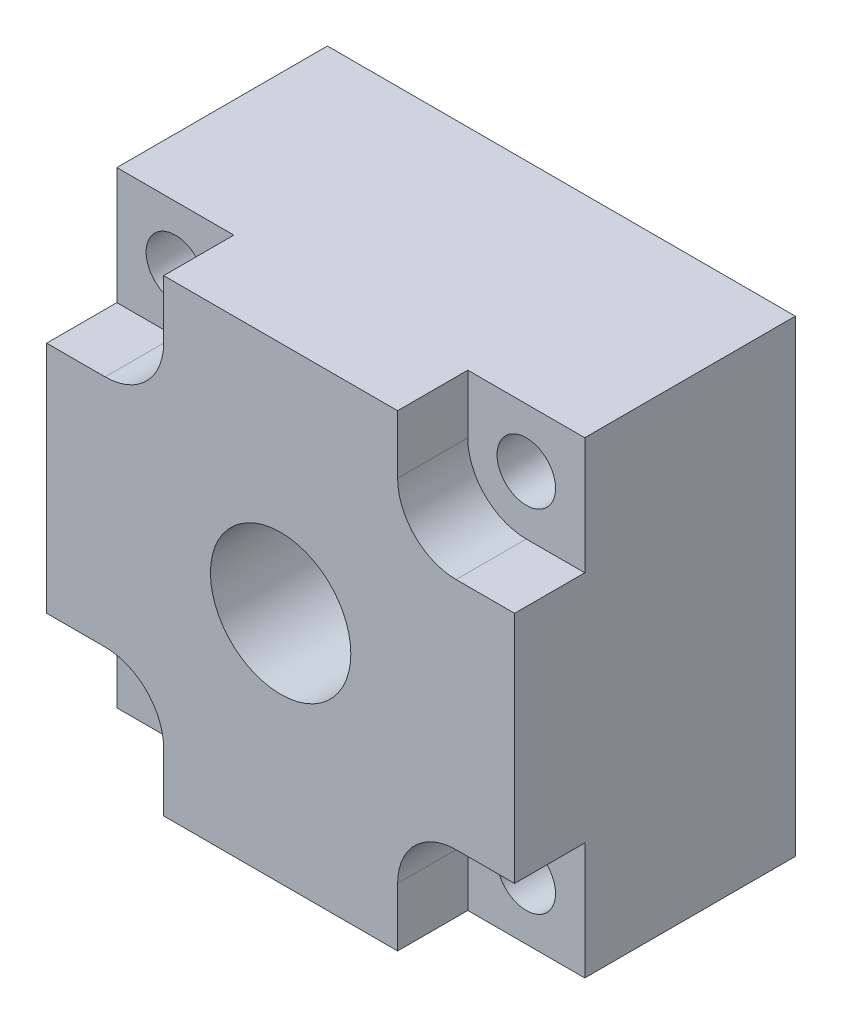
ISO-10303-21;
HEADER;
FILE_DESCRIPTION(('STEP AP214'),'2;1');
FILE_NAME('part.step','',(''),(''),'','','');
FILE_SCHEMA(('AUTOMOTIVE_DESIGN { 1 0 10303 214 1 1 1 1 }'));
ENDSEC;
DATA;
#1=APPLICATION_CONTEXT('core data for automotive mechanical design processes');
#2=APPLICATION_PROTOCOL_DEFINITION('international standard','automotive_design',2000,#1);
#3=PRODUCT_CONTEXT('',#1,'mechanical');
#4=PRODUCT('Part','Part','',(#3));
#5=PRODUCT_RELATED_PRODUCT_CATEGORY('part','',(#4));
#6=PRODUCT_DEFINITION_FORMATION('','',#4);
#7=PRODUCT_DEFINITION_CONTEXT('part definition',#1,'design');
#8=PRODUCT_DEFINITION('design','',#6,#7);
#9=PRODUCT_DEFINITION_SHAPE('','',#8);
#10=(LENGTH_UNIT() NAMED_UNIT(*) SI_UNIT(.MILLI.,.METRE.));
#11=(NAMED_UNIT(*) PLANE_ANGLE_UNIT() SI_UNIT($,.RADIAN.));
#12=(NAMED_UNIT(*) SI_UNIT($,.STERADIAN.) SOLID_ANGLE_UNIT());
#13=UNCERTAINTY_MEASURE_WITH_UNIT(LENGTH_MEASURE(1.E-05),#10,'distance_accuracy_value','');
#14=(GEOMETRIC_REPRESENTATION_CONTEXT(3) GLOBAL_UNCERTAINTY_ASSIGNED_CONTEXT((#13)) GLOBAL_UNIT_ASSIGNED_CONTEXT((#10,
#11,#12)) REPRESENTATION_CONTEXT('',''));
#15=CARTESIAN_POINT('',(0.,0.,0.));
#16=DIRECTION('',(0.,0.,1.));
#17=DIRECTION('',(1.,0.,0.));
#18=AXIS2_PLACEMENT_3D('',#15,#16,#17);
#19=CARTESIAN_POINT('',(-7.5,7.5,12.));
#20=DIRECTION('',(0.,0.,-1.));
#21=DIRECTION('',(-1.,0.,0.));
#22=AXIS2_PLACEMENT_3D('',#19,#20,#21);
#23=CYLINDRICAL_SURFACE('',#22,1.25);
#24=CARTESIAN_POINT('',(-7.5,7.5,0.));
#25=DIRECTION('',(0.,0.,1.));
#26=DIRECTION('',(1.,0.,0.));
#27=AXIS2_PLACEMENT_3D('',#24,#25,#26);
#28=CIRCLE('',#27,1.25);
#29=CARTESIAN_POINT('',(-6.25,7.5,0.));
#30=VERTEX_POINT('',#29);
#31=EDGE_CURVE('E384',#30,#30,#28,.T.);
#32=ORIENTED_EDGE('',*,*,#31,.F.);
#33=EDGE_LOOP('',(#32));
#34=FACE_BOUND('',#33,.T.);
#35=CARTESIAN_POINT('',(-7.5,7.5,9.));
#36=DIRECTION('',(0.,0.,1.));
#37=DIRECTION('',(1.,0.,0.));
#38=AXIS2_PLACEMENT_3D('',#35,#36,#37);
#39=CIRCLE('',#38,1.25);
#40=CARTESIAN_POINT('',(-6.25,7.5,9.));
#41=VERTEX_POINT('',#40);
#42=EDGE_CURVE('E49',#41,#41,#39,.T.);
#43=ORIENTED_EDGE('',*,*,#42,.T.);
#44=EDGE_LOOP('',(#43));
#45=FACE_BOUND('',#44,.T.);
#46=ADVANCED_FACE('F45',(#34,#45),#23,.F.);
#47=CARTESIAN_POINT('',(7.5,7.5,12.));
#48=DIRECTION('',(0.,0.,-1.));
#49=DIRECTION('',(-1.,0.,0.));
#50=AXIS2_PLACEMENT_3D('',#47,#48,#49);
#51=CYLINDRICAL_SURFACE('',#50,1.25);
#52=CARTESIAN_POINT('',(7.5,7.5,0.));
#53=DIRECTION('',(0.,0.,1.));
#54=DIRECTION('',(1.,0.,0.));
#55=AXIS2_PLACEMENT_3D('',#52,#53,#54);
#56=CIRCLE('',#55,1.25);
#57=CARTESIAN_POINT('',(8.75,7.5,0.));
#58=VERTEX_POINT('',#57);
#59=EDGE_CURVE('E380',#58,#58,#56,.T.);
#60=ORIENTED_EDGE('',*,*,#59,.F.);
#61=EDGE_LOOP('',(#60));
#62=FACE_BOUND('',#61,.T.);
#63=CARTESIAN_POINT('',(7.5,7.5,9.));
#64=DIRECTION('',(0.,0.,1.));
#65=DIRECTION('',(1.,0.,0.));
#66=AXIS2_PLACEMENT_3D('',#63,#64,#65);
#67=CIRCLE('',#66,1.25);
#68=CARTESIAN_POINT('',(8.75,7.5,9.));
#69=VERTEX_POINT('',#68);
#70=EDGE_CURVE('E435',#69,#69,#67,.T.);
#71=ORIENTED_EDGE('',*,*,#70,.T.);
#72=EDGE_LOOP('',(#71));
#73=FACE_BOUND('',#72,.T.);
#74=ADVANCED_FACE('F518',(#62,#73),#51,.F.);
#75=CARTESIAN_POINT('',(-7.5,-7.5,12.));
#76=DIRECTION('',(0.,0.,-1.));
#77=DIRECTION('',(-1.,0.,0.));
#78=AXIS2_PLACEMENT_3D('',#75,#76,#77);
#79=CYLINDRICAL_SURFACE('',#78,1.25);
#80=CARTESIAN_POINT('',(-7.5,-7.5,0.));
#81=DIRECTION('',(0.,0.,1.));
#82=DIRECTION('',(1.,0.,0.));
#83=AXIS2_PLACEMENT_3D('',#80,#81,#82);
#84=CIRCLE('',#83,1.25);
#85=CARTESIAN_POINT('',(-6.25,-7.5,0.));
#86=VERTEX_POINT('',#85);
#87=EDGE_CURVE('E376',#86,#86,#84,.T.);
#88=ORIENTED_EDGE('',*,*,#87,.F.);
#89=EDGE_LOOP('',(#88));
#90=FACE_BOUND('',#89,.T.);
#91=CARTESIAN_POINT('',(-7.5,-7.5,9.));
#92=DIRECTION('',(0.,0.,1.));
#93=DIRECTION('',(1.,0.,0.));
#94=AXIS2_PLACEMENT_3D('',#91,#92,#93);
#95=CIRCLE('',#94,1.25);
#96=CARTESIAN_POINT('',(-6.25,-7.5,9.));
#97=VERTEX_POINT('',#96);
#98=EDGE_CURVE('E432',#97,#97,#95,.T.);
#99=ORIENTED_EDGE('',*,*,#98,.T.);
#100=EDGE_LOOP('',(#99));
#101=FACE_BOUND('',#100,.T.);
#102=ADVANCED_FACE('F525',(#90,#101),#79,.F.);
#103=CARTESIAN_POINT('',(7.5,-7.5,12.));
#104=DIRECTION('',(0.,0.,-1.));
#105=DIRECTION('',(-1.,0.,0.));
#106=AXIS2_PLACEMENT_3D('',#103,#104,#105);
#107=CYLINDRICAL_SURFACE('',#106,1.25);
#108=CARTESIAN_POINT('',(7.5,-7.5,0.));
#109=DIRECTION('',(0.,0.,1.));
#110=DIRECTION('',(1.,0.,0.));
#111=AXIS2_PLACEMENT_3D('',#108,#109,#110);
#112=CIRCLE('',#111,1.25);
#113=CARTESIAN_POINT('',(8.75,-7.5,0.));
#114=VERTEX_POINT('',#113);
#115=EDGE_CURVE('E372',#114,#114,#112,.T.);
#116=ORIENTED_EDGE('',*,*,#115,.F.);
#117=EDGE_LOOP('',(#116));
#118=FACE_BOUND('',#117,.T.);
#119=CARTESIAN_POINT('',(7.5,-7.5,9.));
#120=DIRECTION('',(0.,0.,1.));
#121=DIRECTION('',(1.,0.,0.));
#122=AXIS2_PLACEMENT_3D('',#119,#120,#121);
#123=CIRCLE('',#122,1.25);
#124=CARTESIAN_POINT('',(8.75,-7.5,9.));
#125=VERTEX_POINT('',#124);
#126=EDGE_CURVE('E350',#125,#125,#123,.T.);
#127=ORIENTED_EDGE('',*,*,#126,.T.);
#128=EDGE_LOOP('',(#127));
#129=FACE_BOUND('',#128,.T.);
#130=ADVANCED_FACE('F557',(#118,#129),#107,.F.);
#131=CARTESIAN_POINT('',(0.,0.,12.));
#132=DIRECTION('',(0.,0.,-1.));
#133=DIRECTION('',(-1.,0.,0.));
#134=AXIS2_PLACEMENT_3D('',#131,#132,#133);
#135=CYLINDRICAL_SURFACE('',#134,3.);
#136=CARTESIAN_POINT('',(0.,0.,12.));
#137=DIRECTION('',(0.,0.,1.));
#138=DIRECTION('',(1.,0.,0.));
#139=AXIS2_PLACEMENT_3D('',#136,#137,#138);
#140=CIRCLE('',#139,3.);
#141=CARTESIAN_POINT('',(3.,0.,12.));
#142=VERTEX_POINT('',#141);
#143=EDGE_CURVE('E368',#142,#142,#140,.T.);
#144=ORIENTED_EDGE('',*,*,#143,.T.);
#145=EDGE_LOOP('',(#144));
#146=FACE_BOUND('',#145,.T.);
#147=CARTESIAN_POINT('',(0.,0.,5.2));
#148=DIRECTION('',(0.,0.,-1.));
#149=DIRECTION('',(-1.,0.,0.));
#150=AXIS2_PLACEMENT_3D('',#147,#148,#149);
#151=CIRCLE('',#150,3.);
#152=CARTESIAN_POINT('',(-3.,0.,5.2));
#153=VERTEX_POINT('',#152);
#154=EDGE_CURVE('E363',#153,#153,#151,.T.);
#155=ORIENTED_EDGE('',*,*,#154,.T.);
#156=EDGE_LOOP('',(#155));
#157=FACE_BOUND('',#156,.T.);
#158=ADVANCED_FACE('F533',(#146,#157),#135,.F.);
#159=CARTESIAN_POINT('',(0.,0.,12.));
#160=DIRECTION('',(0.,0.,1.));
#161=DIRECTION('',(1.,0.,0.));
#162=AXIS2_PLACEMENT_3D('',#159,#160,#161);
#163=PLANE('',#162);
#164=DIRECTION('',(0.,-1.,0.));
#165=VECTOR('',#164,1.);
#166=CARTESIAN_POINT('',(5.,-7.5,12.));
#167=LINE('',#166,#165);
#168=CARTESIAN_POINT('',(5.,-7.5,12.));
#169=VERTEX_POINT('',#168);
#170=CARTESIAN_POINT('',(5.,-10.,12.));
#171=VERTEX_POINT('',#170);
#172=EDGE_CURVE('E293',#169,#171,#167,.T.);
#173=ORIENTED_EDGE('',*,*,#172,.F.);
#174=CARTESIAN_POINT('',(7.5,-7.5,12.));
#175=DIRECTION('',(0.,0.,1.));
#176=DIRECTION('',(1.,0.,0.));
#177=AXIS2_PLACEMENT_3D('',#174,#175,#176);
#178=CIRCLE('',#177,2.5);
#179=CARTESIAN_POINT('',(7.5,-5.,12.));
#180=VERTEX_POINT('',#179);
#181=EDGE_CURVE('E296',#180,#169,#178,.T.);
#182=ORIENTED_EDGE('',*,*,#181,.F.);
#183=DIRECTION('',(-1.,0.,0.));
#184=VECTOR('',#183,1.);
#185=CARTESIAN_POINT('',(7.5,-5.,12.));
#186=LINE('',#185,#184);
#187=CARTESIAN_POINT('',(10.,-5.,12.));
#188=VERTEX_POINT('',#187);
#189=EDGE_CURVE('E253',#188,#180,#186,.T.);
#190=ORIENTED_EDGE('',*,*,#189,.F.);
#191=DIRECTION('',(0.,1.,0.));
#192=VECTOR('',#191,1.);
#193=CARTESIAN_POINT('',(10.,10.,12.));
#194=LINE('',#193,#192);
#195=CARTESIAN_POINT('',(10.,4.99999999999999,12.));
#196=VERTEX_POINT('',#195);
#197=EDGE_CURVE('E389',#188,#196,#194,.T.);
#198=ORIENTED_EDGE('',*,*,#197,.T.);
#199=DIRECTION('',(1.,0.,0.));
#200=VECTOR('',#199,1.);
#201=CARTESIAN_POINT('',(7.5,4.99999999999999,12.));
#202=LINE('',#201,#200);
#203=CARTESIAN_POINT('',(7.5,4.99999999999999,12.));
#204=VERTEX_POINT('',#203);
#205=EDGE_CURVE('E258',#204,#196,#202,.T.);
#206=ORIENTED_EDGE('',*,*,#205,.F.);
#207=CARTESIAN_POINT('',(7.5,7.5,12.));
#208=DIRECTION('',(0.,0.,1.));
#209=DIRECTION('',(1.,0.,0.));
#210=AXIS2_PLACEMENT_3D('',#207,#208,#209);
#211=CIRCLE('',#210,2.5);
#212=CARTESIAN_POINT('',(5.,7.5,12.));
#213=VERTEX_POINT('',#212);
#214=EDGE_CURVE('E199',#213,#204,#211,.T.);
#215=ORIENTED_EDGE('',*,*,#214,.F.);
#216=DIRECTION('',(0.,-1.,0.));
#217=VECTOR('',#216,1.);
#218=CARTESIAN_POINT('',(5.,7.5,12.));
#219=LINE('',#218,#217);
#220=CARTESIAN_POINT('',(5.,10.,12.));
#221=VERTEX_POINT('',#220);
#222=EDGE_CURVE('E254',#221,#213,#219,.T.);
#223=ORIENTED_EDGE('',*,*,#222,.F.);
#224=DIRECTION('',(-1.,0.,0.));
#225=VECTOR('',#224,1.);
#226=CARTESIAN_POINT('',(-10.,10.,12.));
#227=LINE('',#226,#225);
#228=CARTESIAN_POINT('',(-5.,10.,12.));
#229=VERTEX_POINT('',#228);
#230=EDGE_CURVE('E393',#221,#229,#227,.T.);
#231=ORIENTED_EDGE('',*,*,#230,.T.);
#232=DIRECTION('',(0.,1.,0.));
#233=VECTOR('',#232,1.);
#234=CARTESIAN_POINT('',(-5.,7.5,12.));
#235=LINE('',#234,#233);
#236=CARTESIAN_POINT('',(-5.,7.5,12.));
#237=VERTEX_POINT('',#236);
#238=EDGE_CURVE('E209',#237,#229,#235,.T.);
#239=ORIENTED_EDGE('',*,*,#238,.F.);
#240=CARTESIAN_POINT('',(-7.5,7.5,12.));
#241=DIRECTION('',(0.,0.,1.));
#242=DIRECTION('',(1.,0.,0.));
#243=AXIS2_PLACEMENT_3D('',#240,#241,#242);
#244=CIRCLE('',#243,2.5);
#245=CARTESIAN_POINT('',(-7.5,4.99999999999999,12.));
#246=VERTEX_POINT('',#245);
#247=EDGE_CURVE('E190',#246,#237,#244,.T.);
#248=ORIENTED_EDGE('',*,*,#247,.F.);
#249=DIRECTION('',(1.,0.,0.));
#250=VECTOR('',#249,1.);
#251=CARTESIAN_POINT('',(-7.5,4.99999999999999,12.));
#252=LINE('',#251,#250);
#253=CARTESIAN_POINT('',(-10.,4.99999999999999,12.));
#254=VERTEX_POINT('',#253);
#255=EDGE_CURVE('E202',#254,#246,#252,.T.);
#256=ORIENTED_EDGE('',*,*,#255,.F.);
#257=DIRECTION('',(0.,-1.,0.));
#258=VECTOR('',#257,1.);
#259=CARTESIAN_POINT('',(-10.,10.,12.));
#260=LINE('',#259,#258);
#261=CARTESIAN_POINT('',(-10.,-5.,12.));
#262=VERTEX_POINT('',#261);
#263=EDGE_CURVE('E397',#254,#262,#260,.T.);
#264=ORIENTED_EDGE('',*,*,#263,.T.);
#265=DIRECTION('',(-1.,0.,0.));
#266=VECTOR('',#265,1.);
#267=CARTESIAN_POINT('',(-7.5,-5.,12.));
#268=LINE('',#267,#266);
#269=CARTESIAN_POINT('',(-7.5,-5.,12.));
#270=VERTEX_POINT('',#269);
#271=EDGE_CURVE('E324',#270,#262,#268,.T.);
#272=ORIENTED_EDGE('',*,*,#271,.F.);
#273=CARTESIAN_POINT('',(-7.5,-7.5,12.));
#274=DIRECTION('',(0.,0.,1.));
#275=DIRECTION('',(1.,0.,0.));
#276=AXIS2_PLACEMENT_3D('',#273,#274,#275);
#277=CIRCLE('',#276,2.5);
#278=CARTESIAN_POINT('',(-5.,-7.5,12.));
#279=VERTEX_POINT('',#278);
#280=EDGE_CURVE('E221',#279,#270,#277,.T.);
#281=ORIENTED_EDGE('',*,*,#280,.F.);
#282=DIRECTION('',(0.,1.,0.));
#283=VECTOR('',#282,1.);
#284=CARTESIAN_POINT('',(-5.,-7.5,12.));
#285=LINE('',#284,#283);
#286=CARTESIAN_POINT('',(-5.,-10.,12.));
#287=VERTEX_POINT('',#286);
#288=EDGE_CURVE('E216',#287,#279,#285,.T.);
#289=ORIENTED_EDGE('',*,*,#288,.F.);
#290=DIRECTION('',(1.,0.,0.));
#291=VECTOR('',#290,1.);
#292=CARTESIAN_POINT('',(-10.,-10.,12.));
#293=LINE('',#292,#291);
#294=EDGE_CURVE('E400',#287,#171,#293,.T.);
#295=ORIENTED_EDGE('',*,*,#294,.T.);
#296=EDGE_LOOP('',(#173,#182,#190,#198,#206,#215,#223,#231,#239,#248,#256,#264,#272,#281,#289,#295));
#297=FACE_BOUND('',#296,.T.);
#298=ORIENTED_EDGE('',*,*,#143,.F.);
#299=EDGE_LOOP('',(#298));
#300=FACE_BOUND('',#299,.T.);
#301=ADVANCED_FACE('F212',(#297,#300),#163,.T.);
#302=CARTESIAN_POINT('',(0.,0.,0.));
#303=DIRECTION('',(0.,0.,1.));
#304=DIRECTION('',(1.,0.,0.));
#305=AXIS2_PLACEMENT_3D('',#302,#303,#304);
#306=PLANE('',#305);
#307=CARTESIAN_POINT('',(0.,0.,0.));
#308=DIRECTION('',(0.,0.,-1.));
#309=DIRECTION('',(-1.,0.,0.));
#310=AXIS2_PLACEMENT_3D('',#307,#308,#309);
#311=CIRCLE('',#310,7.5);
#312=CARTESIAN_POINT('',(-7.5,0.,0.));
#313=VERTEX_POINT('',#312);
#314=EDGE_CURVE('E364',#313,#313,#311,.T.);
#315=ORIENTED_EDGE('',*,*,#314,.F.);
#316=EDGE_LOOP('',(#315));
#317=FACE_BOUND('',#316,.T.);
#318=DIRECTION('',(0.,1.,0.));
#319=VECTOR('',#318,1.);
#320=CARTESIAN_POINT('',(10.,10.,0.));
#321=LINE('',#320,#319);
#322=CARTESIAN_POINT('',(10.,-10.,0.));
#323=VERTEX_POINT('',#322);
#324=CARTESIAN_POINT('',(10.,10.,0.));
#325=VERTEX_POINT('',#324);
#326=EDGE_CURVE('E388',#323,#325,#321,.T.);
#327=ORIENTED_EDGE('',*,*,#326,.F.);
#328=DIRECTION('',(1.,0.,0.));
#329=VECTOR('',#328,1.);
#330=CARTESIAN_POINT('',(-10.,-10.,0.));
#331=LINE('',#330,#329);
#332=CARTESIAN_POINT('',(-10.,-10.,0.));
#333=VERTEX_POINT('',#332);
#334=EDGE_CURVE('E394',#333,#323,#331,.T.);
#335=ORIENTED_EDGE('',*,*,#334,.F.);
#336=DIRECTION('',(0.,-1.,0.));
#337=VECTOR('',#336,1.);
#338=CARTESIAN_POINT('',(-10.,10.,0.));
#339=LINE('',#338,#337);
#340=CARTESIAN_POINT('',(-10.,10.,0.));
#341=VERTEX_POINT('',#340);
#342=EDGE_CURVE('E412',#341,#333,#339,.T.);
#343=ORIENTED_EDGE('',*,*,#342,.F.);
#344=DIRECTION('',(-1.,0.,0.));
#345=VECTOR('',#344,1.);
#346=CARTESIAN_POINT('',(-10.,10.,0.));
#347=LINE('',#346,#345);
#348=EDGE_CURVE('E408',#325,#341,#347,.T.);
#349=ORIENTED_EDGE('',*,*,#348,.F.);
#350=EDGE_LOOP('',(#327,#335,#343,#349));
#351=FACE_BOUND('',#350,.T.);
#352=ORIENTED_EDGE('',*,*,#31,.T.);
#353=EDGE_LOOP('',(#352));
#354=FACE_BOUND('',#353,.T.);
#355=ORIENTED_EDGE('',*,*,#59,.T.);
#356=EDGE_LOOP('',(#355));
#357=FACE_BOUND('',#356,.T.);
#358=ORIENTED_EDGE('',*,*,#87,.T.);
#359=EDGE_LOOP('',(#358));
#360=FACE_BOUND('',#359,.T.);
#361=ORIENTED_EDGE('',*,*,#115,.T.);
#362=EDGE_LOOP('',(#361));
#363=FACE_BOUND('',#362,.T.);
#364=ADVANCED_FACE('F482',(#317,#351,#354,#357,#360,#363),#306,.F.);
#365=CARTESIAN_POINT('',(10.,10.,12.));
#366=DIRECTION('',(-1.,0.,0.));
#367=DIRECTION('',(0.,-1.,0.));
#368=AXIS2_PLACEMENT_3D('',#365,#366,#367);
#369=PLANE('',#368);
#370=ORIENTED_EDGE('',*,*,#197,.F.);
#371=DIRECTION('',(0.,0.,1.));
#372=VECTOR('',#371,1.);
#373=CARTESIAN_POINT('',(10.,-5.,9.));
#374=LINE('',#373,#372);
#375=CARTESIAN_POINT('',(10.,-5.,9.));
#376=VERTEX_POINT('',#375);
#377=EDGE_CURVE('E279',#376,#188,#374,.T.);
#378=ORIENTED_EDGE('',*,*,#377,.F.);
#379=DIRECTION('',(0.,1.,0.));
#380=VECTOR('',#379,1.);
#381=CARTESIAN_POINT('',(10.,-5.,9.));
#382=LINE('',#381,#380);
#383=CARTESIAN_POINT('',(10.,-10.,9.));
#384=VERTEX_POINT('',#383);
#385=EDGE_CURVE('E297',#384,#376,#382,.T.);
#386=ORIENTED_EDGE('',*,*,#385,.F.);
#387=DIRECTION('',(0.,0.,-1.));
#388=VECTOR('',#387,1.);
#389=CARTESIAN_POINT('',(10.,-10.,12.));
#390=LINE('',#389,#388);
#391=EDGE_CURVE('E404',#384,#323,#390,.T.);
#392=ORIENTED_EDGE('',*,*,#391,.T.);
#393=ORIENTED_EDGE('',*,*,#326,.T.);
#394=DIRECTION('',(0.,0.,-1.));
#395=VECTOR('',#394,1.);
#396=CARTESIAN_POINT('',(10.,10.,12.));
#397=LINE('',#396,#395);
#398=CARTESIAN_POINT('',(10.,10.,9.));
#399=VERTEX_POINT('',#398);
#400=EDGE_CURVE('E11',#399,#325,#397,.T.);
#401=ORIENTED_EDGE('',*,*,#400,.F.);
#402=DIRECTION('',(0.,1.,0.));
#403=VECTOR('',#402,1.);
#404=CARTESIAN_POINT('',(10.,4.99999999999999,9.));
#405=LINE('',#404,#403);
#406=CARTESIAN_POINT('',(10.,4.99999999999999,9.));
#407=VERTEX_POINT('',#406);
#408=EDGE_CURVE('E63',#407,#399,#405,.T.);
#409=ORIENTED_EDGE('',*,*,#408,.F.);
#410=DIRECTION('',(0.,0.,1.));
#411=VECTOR('',#410,1.);
#412=CARTESIAN_POINT('',(10.,4.99999999999999,9.));
#413=LINE('',#412,#411);
#414=EDGE_CURVE('E243',#407,#196,#413,.T.);
#415=ORIENTED_EDGE('',*,*,#414,.T.);
#416=EDGE_LOOP('',(#370,#378,#386,#392,#393,#401,#409,#415));
#417=FACE_BOUND('',#416,.T.);
#418=ADVANCED_FACE('F47',(#417),#369,.F.);
#419=CARTESIAN_POINT('',(-10.,10.,12.));
#420=DIRECTION('',(0.,-1.,0.));
#421=DIRECTION('',(0.,0.,-1.));
#422=AXIS2_PLACEMENT_3D('',#419,#420,#421);
#423=PLANE('',#422);
#424=ORIENTED_EDGE('',*,*,#230,.F.);
#425=DIRECTION('',(0.,0.,1.));
#426=VECTOR('',#425,1.);
#427=CARTESIAN_POINT('',(5.,10.,9.));
#428=LINE('',#427,#426);
#429=CARTESIAN_POINT('',(5.,10.,9.));
#430=VERTEX_POINT('',#429);
#431=EDGE_CURVE('E247',#430,#221,#428,.T.);
#432=ORIENTED_EDGE('',*,*,#431,.F.);
#433=DIRECTION('',(-1.,0.,0.));
#434=VECTOR('',#433,1.);
#435=CARTESIAN_POINT('',(5.,10.,9.));
#436=LINE('',#435,#434);
#437=EDGE_CURVE('E268',#399,#430,#436,.T.);
#438=ORIENTED_EDGE('',*,*,#437,.F.);
#439=ORIENTED_EDGE('',*,*,#400,.T.);
#440=ORIENTED_EDGE('',*,*,#348,.T.);
#441=DIRECTION('',(0.,0.,-1.));
#442=VECTOR('',#441,1.);
#443=CARTESIAN_POINT('',(-10.,10.,12.));
#444=LINE('',#443,#442);
#445=CARTESIAN_POINT('',(-10.,10.,9.));
#446=VERTEX_POINT('',#445);
#447=EDGE_CURVE('E55',#446,#341,#444,.T.);
#448=ORIENTED_EDGE('',*,*,#447,.F.);
#449=DIRECTION('',(-1.,0.,0.));
#450=VECTOR('',#449,1.);
#451=CARTESIAN_POINT('',(-5.,10.,9.));
#452=LINE('',#451,#450);
#453=CARTESIAN_POINT('',(-5.,10.,9.));
#454=VERTEX_POINT('',#453);
#455=EDGE_CURVE('E71',#454,#446,#452,.T.);
#456=ORIENTED_EDGE('',*,*,#455,.F.);
#457=DIRECTION('',(0.,0.,1.));
#458=VECTOR('',#457,1.);
#459=CARTESIAN_POINT('',(-5.,10.,9.));
#460=LINE('',#459,#458);
#461=EDGE_CURVE('E454',#454,#229,#460,.T.);
#462=ORIENTED_EDGE('',*,*,#461,.T.);
#463=EDGE_LOOP('',(#424,#432,#438,#439,#440,#448,#456,#462));
#464=FACE_BOUND('',#463,.T.);
#465=ADVANCED_FACE('F464',(#464),#423,.F.);
#466=CARTESIAN_POINT('',(-10.,10.,12.));
#467=DIRECTION('',(1.,0.,0.));
#468=DIRECTION('',(0.,1.,0.));
#469=AXIS2_PLACEMENT_3D('',#466,#467,#468);
#470=PLANE('',#469);
#471=ORIENTED_EDGE('',*,*,#263,.F.);
#472=DIRECTION('',(0.,0.,1.));
#473=VECTOR('',#472,1.);
#474=CARTESIAN_POINT('',(-10.,4.99999999999999,9.));
#475=LINE('',#474,#473);
#476=CARTESIAN_POINT('',(-10.,4.99999999999999,9.));
#477=VERTEX_POINT('',#476);
#478=EDGE_CURVE('E198',#477,#254,#475,.T.);
#479=ORIENTED_EDGE('',*,*,#478,.F.);
#480=DIRECTION('',(0.,-1.,0.));
#481=VECTOR('',#480,1.);
#482=CARTESIAN_POINT('',(-10.,4.99999999999999,9.));
#483=LINE('',#482,#481);
#484=EDGE_CURVE('E228',#446,#477,#483,.T.);
#485=ORIENTED_EDGE('',*,*,#484,.F.);
#486=ORIENTED_EDGE('',*,*,#447,.T.);
#487=ORIENTED_EDGE('',*,*,#342,.T.);
#488=DIRECTION('',(0.,0.,-1.));
#489=VECTOR('',#488,1.);
#490=CARTESIAN_POINT('',(-10.,-10.,12.));
#491=LINE('',#490,#489);
#492=CARTESIAN_POINT('',(-10.,-10.,9.));
#493=VERTEX_POINT('',#492);
#494=EDGE_CURVE('E421',#493,#333,#491,.T.);
#495=ORIENTED_EDGE('',*,*,#494,.F.);
#496=DIRECTION('',(0.,-1.,0.));
#497=VECTOR('',#496,1.);
#498=CARTESIAN_POINT('',(-10.,-5.,9.));
#499=LINE('',#498,#497);
#500=CARTESIAN_POINT('',(-10.,-5.,9.));
#501=VERTEX_POINT('',#500);
#502=EDGE_CURVE('E320',#501,#493,#499,.T.);
#503=ORIENTED_EDGE('',*,*,#502,.F.);
#504=DIRECTION('',(0.,0.,1.));
#505=VECTOR('',#504,1.);
#506=CARTESIAN_POINT('',(-10.,-5.,9.));
#507=LINE('',#506,#505);
#508=EDGE_CURVE('E346',#501,#262,#507,.T.);
#509=ORIENTED_EDGE('',*,*,#508,.T.);
#510=EDGE_LOOP('',(#471,#479,#485,#486,#487,#495,#503,#509));
#511=FACE_BOUND('',#510,.T.);
#512=ADVANCED_FACE('F451',(#511),#470,.F.);
#513=CARTESIAN_POINT('',(-10.,-10.,12.));
#514=DIRECTION('',(0.,1.,0.));
#515=DIRECTION('',(0.,0.,1.));
#516=AXIS2_PLACEMENT_3D('',#513,#514,#515);
#517=PLANE('',#516);
#518=DIRECTION('',(1.,0.,0.));
#519=VECTOR('',#518,1.);
#520=CARTESIAN_POINT('',(5.,-10.,9.));
#521=LINE('',#520,#519);
#522=CARTESIAN_POINT('',(5.,-10.,9.));
#523=VERTEX_POINT('',#522);
#524=EDGE_CURVE('E282',#523,#384,#521,.T.);
#525=ORIENTED_EDGE('',*,*,#524,.F.);
#526=DIRECTION('',(0.,0.,1.));
#527=VECTOR('',#526,1.);
#528=CARTESIAN_POINT('',(5.,-10.,9.));
#529=LINE('',#528,#527);
#530=EDGE_CURVE('E289',#523,#171,#529,.T.);
#531=ORIENTED_EDGE('',*,*,#530,.T.);
#532=ORIENTED_EDGE('',*,*,#294,.F.);
#533=DIRECTION('',(0.,0.,1.));
#534=VECTOR('',#533,1.);
#535=CARTESIAN_POINT('',(-5.,-10.,9.));
#536=LINE('',#535,#534);
#537=CARTESIAN_POINT('',(-5.,-10.,9.));
#538=VERTEX_POINT('',#537);
#539=EDGE_CURVE('E339',#538,#287,#536,.T.);
#540=ORIENTED_EDGE('',*,*,#539,.F.);
#541=DIRECTION('',(1.,0.,0.));
#542=VECTOR('',#541,1.);
#543=CARTESIAN_POINT('',(-10.,-10.,9.));
#544=LINE('',#543,#542);
#545=EDGE_CURVE('E323',#493,#538,#544,.T.);
#546=ORIENTED_EDGE('',*,*,#545,.F.);
#547=ORIENTED_EDGE('',*,*,#494,.T.);
#548=ORIENTED_EDGE('',*,*,#334,.T.);
#549=ORIENTED_EDGE('',*,*,#391,.F.);
#550=EDGE_LOOP('',(#525,#531,#532,#540,#546,#547,#548,#549));
#551=FACE_BOUND('',#550,.T.);
#552=ADVANCED_FACE('F490',(#551),#517,.F.);
#553=CARTESIAN_POINT('',(0.,0.,5.2));
#554=DIRECTION('',(0.,0.,-1.));
#555=DIRECTION('',(-1.,0.,0.));
#556=AXIS2_PLACEMENT_3D('',#553,#554,#555);
#557=CYLINDRICAL_SURFACE('',#556,7.5);
#558=CARTESIAN_POINT('',(0.,0.,5.2));
#559=DIRECTION('',(0.,0.,-1.));
#560=DIRECTION('',(-1.,0.,0.));
#561=AXIS2_PLACEMENT_3D('',#558,#559,#560);
#562=CIRCLE('',#561,7.5);
#563=CARTESIAN_POINT('',(-7.5,0.,5.2));
#564=VERTEX_POINT('',#563);
#565=EDGE_CURVE('E359',#564,#564,#562,.T.);
#566=ORIENTED_EDGE('',*,*,#565,.F.);
#567=EDGE_LOOP('',(#566));
#568=FACE_BOUND('',#567,.T.);
#569=ORIENTED_EDGE('',*,*,#314,.T.);
#570=EDGE_LOOP('',(#569));
#571=FACE_BOUND('',#570,.T.);
#572=ADVANCED_FACE('F539',(#568,#571),#557,.F.);
#573=CARTESIAN_POINT('',(0.,0.,5.2));
#574=DIRECTION('',(0.,0.,-1.));
#575=DIRECTION('',(-1.,0.,0.));
#576=AXIS2_PLACEMENT_3D('',#573,#574,#575);
#577=PLANE('',#576);
#578=ORIENTED_EDGE('',*,*,#154,.F.);
#579=EDGE_LOOP('',(#578));
#580=FACE_BOUND('',#579,.T.);
#581=ORIENTED_EDGE('',*,*,#565,.T.);
#582=EDGE_LOOP('',(#581));
#583=FACE_BOUND('',#582,.T.);
#584=ADVANCED_FACE('F588',(#580,#583),#577,.T.);
#585=CARTESIAN_POINT('',(5.,-7.5,9.));
#586=DIRECTION('',(-1.,0.,0.));
#587=DIRECTION('',(0.,0.,1.));
#588=AXIS2_PLACEMENT_3D('',#585,#586,#587);
#589=PLANE('',#588);
#590=ORIENTED_EDGE('',*,*,#172,.T.);
#591=ORIENTED_EDGE('',*,*,#530,.F.);
#592=DIRECTION('',(0.,-1.,0.));
#593=VECTOR('',#592,1.);
#594=CARTESIAN_POINT('',(5.,-7.5,9.));
#595=LINE('',#594,#593);
#596=CARTESIAN_POINT('',(5.,-7.5,9.));
#597=VERTEX_POINT('',#596);
#598=EDGE_CURVE('E306',#597,#523,#595,.T.);
#599=ORIENTED_EDGE('',*,*,#598,.F.);
#600=DIRECTION('',(0.,0.,1.));
#601=VECTOR('',#600,1.);
#602=CARTESIAN_POINT('',(5.,-7.5,9.));
#603=LINE('',#602,#601);
#604=EDGE_CURVE('E286',#597,#169,#603,.T.);
#605=ORIENTED_EDGE('',*,*,#604,.T.);
#606=EDGE_LOOP('',(#590,#591,#599,#605));
#607=FACE_BOUND('',#606,.T.);
#608=ADVANCED_FACE('F583',(#607),#589,.F.);
#609=CARTESIAN_POINT('',(7.5,-7.5,9.));
#610=DIRECTION('',(0.,0.,1.));
#611=DIRECTION('',(1.,0.,0.));
#612=AXIS2_PLACEMENT_3D('',#609,#610,#611);
#613=CYLINDRICAL_SURFACE('',#612,2.5);
#614=ORIENTED_EDGE('',*,*,#181,.T.);
#615=ORIENTED_EDGE('',*,*,#604,.F.);
#616=CARTESIAN_POINT('',(7.5,-7.5,9.));
#617=DIRECTION('',(0.,0.,1.));
#618=DIRECTION('',(1.,0.,0.));
#619=AXIS2_PLACEMENT_3D('',#616,#617,#618);
#620=CIRCLE('',#619,2.5);
#621=CARTESIAN_POINT('',(7.5,-5.,9.));
#622=VERTEX_POINT('',#621);
#623=EDGE_CURVE('E309',#622,#597,#620,.T.);
#624=ORIENTED_EDGE('',*,*,#623,.F.);
#625=DIRECTION('',(0.,0.,1.));
#626=VECTOR('',#625,1.);
#627=CARTESIAN_POINT('',(7.5,-5.,9.));
#628=LINE('',#627,#626);
#629=EDGE_CURVE('E283',#622,#180,#628,.T.);
#630=ORIENTED_EDGE('',*,*,#629,.T.);
#631=EDGE_LOOP('',(#614,#615,#624,#630));
#632=FACE_BOUND('',#631,.T.);
#633=ADVANCED_FACE('F587',(#632),#613,.F.);
#634=CARTESIAN_POINT('',(7.5,-5.,9.));
#635=DIRECTION('',(0.,1.,0.));
#636=DIRECTION('',(-1.,0.,0.));
#637=AXIS2_PLACEMENT_3D('',#634,#635,#636);
#638=PLANE('',#637);
#639=ORIENTED_EDGE('',*,*,#189,.T.);
#640=ORIENTED_EDGE('',*,*,#629,.F.);
#641=DIRECTION('',(-1.,0.,0.));
#642=VECTOR('',#641,1.);
#643=CARTESIAN_POINT('',(7.5,-5.,9.));
#644=LINE('',#643,#642);
#645=EDGE_CURVE('E313',#376,#622,#644,.T.);
#646=ORIENTED_EDGE('',*,*,#645,.F.);
#647=ORIENTED_EDGE('',*,*,#377,.T.);
#648=EDGE_LOOP('',(#639,#640,#646,#647));
#649=FACE_BOUND('',#648,.T.);
#650=ADVANCED_FACE('F597',(#649),#638,.F.);
#651=CARTESIAN_POINT('',(7.5,-7.5,9.));
#652=DIRECTION('',(0.,0.,1.));
#653=DIRECTION('',(1.,0.,0.));
#654=AXIS2_PLACEMENT_3D('',#651,#652,#653);
#655=PLANE('',#654);
#656=ORIENTED_EDGE('',*,*,#126,.F.);
#657=EDGE_LOOP('',(#656));
#658=FACE_BOUND('',#657,.T.);
#659=ORIENTED_EDGE('',*,*,#385,.T.);
#660=ORIENTED_EDGE('',*,*,#645,.T.);
#661=ORIENTED_EDGE('',*,*,#623,.T.);
#662=ORIENTED_EDGE('',*,*,#598,.T.);
#663=ORIENTED_EDGE('',*,*,#524,.T.);
#664=EDGE_LOOP('',(#659,#660,#661,#662,#663));
#665=FACE_BOUND('',#664,.T.);
#666=ADVANCED_FACE('F606',(#658,#665),#655,.T.);
#667=CARTESIAN_POINT('',(-7.5,-5.,9.));
#668=DIRECTION('',(0.,1.,0.));
#669=DIRECTION('',(0.,0.,1.));
#670=AXIS2_PLACEMENT_3D('',#667,#668,#669);
#671=PLANE('',#670);
#672=ORIENTED_EDGE('',*,*,#271,.T.);
#673=ORIENTED_EDGE('',*,*,#508,.F.);
#674=DIRECTION('',(-1.,0.,0.));
#675=VECTOR('',#674,1.);
#676=CARTESIAN_POINT('',(-7.5,-5.,9.));
#677=LINE('',#676,#675);
#678=CARTESIAN_POINT('',(-7.5,-5.,9.));
#679=VERTEX_POINT('',#678);
#680=EDGE_CURVE('E336',#679,#501,#677,.T.);
#681=ORIENTED_EDGE('',*,*,#680,.F.);
#682=DIRECTION('',(0.,0.,1.));
#683=VECTOR('',#682,1.);
#684=CARTESIAN_POINT('',(-7.5,-5.,9.));
#685=LINE('',#684,#683);
#686=EDGE_CURVE('E351',#679,#270,#685,.T.);
#687=ORIENTED_EDGE('',*,*,#686,.T.);
#688=EDGE_LOOP('',(#672,#673,#681,#687));
#689=FACE_BOUND('',#688,.T.);
#690=ADVANCED_FACE('F498',(#689),#671,.F.);
#691=CARTESIAN_POINT('',(-7.5,-7.5,9.));
#692=DIRECTION('',(0.,0.,1.));
#693=DIRECTION('',(1.,0.,0.));
#694=AXIS2_PLACEMENT_3D('',#691,#692,#693);
#695=CYLINDRICAL_SURFACE('',#694,2.5);
#696=ORIENTED_EDGE('',*,*,#280,.T.);
#697=ORIENTED_EDGE('',*,*,#686,.F.);
#698=CARTESIAN_POINT('',(-7.5,-7.5,9.));
#699=DIRECTION('',(0.,0.,1.));
#700=DIRECTION('',(1.,0.,0.));
#701=AXIS2_PLACEMENT_3D('',#698,#699,#700);
#702=CIRCLE('',#701,2.5);
#703=CARTESIAN_POINT('',(-5.,-7.5,9.));
#704=VERTEX_POINT('',#703);
#705=EDGE_CURVE('E332',#704,#679,#702,.T.);
#706=ORIENTED_EDGE('',*,*,#705,.F.);
#707=DIRECTION('',(0.,0.,1.));
#708=VECTOR('',#707,1.);
#709=CARTESIAN_POINT('',(-5.,-7.5,9.));
#710=LINE('',#709,#708);
#711=EDGE_CURVE('E354',#704,#279,#710,.T.);
#712=ORIENTED_EDGE('',*,*,#711,.T.);
#713=EDGE_LOOP('',(#696,#697,#706,#712));
#714=FACE_BOUND('',#713,.T.);
#715=ADVANCED_FACE('F503',(#714),#695,.F.);
#716=CARTESIAN_POINT('',(-5.,-7.5,9.));
#717=DIRECTION('',(1.,0.,0.));
#718=DIRECTION('',(0.,1.,0.));
#719=AXIS2_PLACEMENT_3D('',#716,#717,#718);
#720=PLANE('',#719);
#721=ORIENTED_EDGE('',*,*,#288,.T.);
#722=ORIENTED_EDGE('',*,*,#711,.F.);
#723=DIRECTION('',(0.,1.,0.));
#724=VECTOR('',#723,1.);
#725=CARTESIAN_POINT('',(-5.,-7.5,9.));
#726=LINE('',#725,#724);
#727=EDGE_CURVE('E328',#538,#704,#726,.T.);
#728=ORIENTED_EDGE('',*,*,#727,.F.);
#729=ORIENTED_EDGE('',*,*,#539,.T.);
#730=EDGE_LOOP('',(#721,#722,#728,#729));
#731=FACE_BOUND('',#730,.T.);
#732=ADVANCED_FACE('F505',(#731),#720,.F.);
#733=CARTESIAN_POINT('',(-7.5,-7.5,9.));
#734=DIRECTION('',(0.,0.,1.));
#735=DIRECTION('',(1.,0.,0.));
#736=AXIS2_PLACEMENT_3D('',#733,#734,#735);
#737=PLANE('',#736);
#738=ORIENTED_EDGE('',*,*,#98,.F.);
#739=EDGE_LOOP('',(#738));
#740=FACE_BOUND('',#739,.T.);
#741=ORIENTED_EDGE('',*,*,#502,.T.);
#742=ORIENTED_EDGE('',*,*,#545,.T.);
#743=ORIENTED_EDGE('',*,*,#727,.T.);
#744=ORIENTED_EDGE('',*,*,#705,.T.);
#745=ORIENTED_EDGE('',*,*,#680,.T.);
#746=EDGE_LOOP('',(#741,#742,#743,#744,#745));
#747=FACE_BOUND('',#746,.T.);
#748=ADVANCED_FACE('F494',(#740,#747),#737,.T.);
#749=CARTESIAN_POINT('',(7.5,7.5,9.));
#750=DIRECTION('',(0.,0.,1.));
#751=DIRECTION('',(1.,0.,0.));
#752=AXIS2_PLACEMENT_3D('',#749,#750,#751);
#753=CYLINDRICAL_SURFACE('',#752,2.5);
#754=ORIENTED_EDGE('',*,*,#214,.T.);
#755=DIRECTION('',(0.,0.,1.));
#756=VECTOR('',#755,1.);
#757=CARTESIAN_POINT('',(7.5,4.99999999999999,9.));
#758=LINE('',#757,#756);
#759=CARTESIAN_POINT('',(7.5,4.99999999999999,9.));
#760=VERTEX_POINT('',#759);
#761=EDGE_CURVE('E239',#760,#204,#758,.T.);
#762=ORIENTED_EDGE('',*,*,#761,.F.);
#763=CARTESIAN_POINT('',(7.5,7.5,9.));
#764=DIRECTION('',(0.,0.,1.));
#765=DIRECTION('',(1.,0.,0.));
#766=AXIS2_PLACEMENT_3D('',#763,#764,#765);
#767=CIRCLE('',#766,2.5);
#768=CARTESIAN_POINT('',(5.,7.5,9.));
#769=VERTEX_POINT('',#768);
#770=EDGE_CURVE('E259',#769,#760,#767,.T.);
#771=ORIENTED_EDGE('',*,*,#770,.F.);
#772=DIRECTION('',(0.,0.,1.));
#773=VECTOR('',#772,1.);
#774=CARTESIAN_POINT('',(5.,7.5,9.));
#775=LINE('',#774,#773);
#776=EDGE_CURVE('E250',#769,#213,#775,.T.);
#777=ORIENTED_EDGE('',*,*,#776,.T.);
#778=EDGE_LOOP('',(#754,#762,#771,#777));
#779=FACE_BOUND('',#778,.T.);
#780=ADVANCED_FACE('F512',(#779),#753,.F.);
#781=CARTESIAN_POINT('',(5.,7.5,9.));
#782=DIRECTION('',(-1.,0.,0.));
#783=DIRECTION('',(0.,0.,1.));
#784=AXIS2_PLACEMENT_3D('',#781,#782,#783);
#785=PLANE('',#784);
#786=ORIENTED_EDGE('',*,*,#222,.T.);
#787=ORIENTED_EDGE('',*,*,#776,.F.);
#788=DIRECTION('',(0.,-1.,0.));
#789=VECTOR('',#788,1.);
#790=CARTESIAN_POINT('',(5.,7.5,9.));
#791=LINE('',#790,#789);
#792=EDGE_CURVE('E242',#430,#769,#791,.T.);
#793=ORIENTED_EDGE('',*,*,#792,.F.);
#794=ORIENTED_EDGE('',*,*,#431,.T.);
#795=EDGE_LOOP('',(#786,#787,#793,#794));
#796=FACE_BOUND('',#795,.T.);
#797=ADVANCED_FACE('F470',(#796),#785,.F.);
#798=CARTESIAN_POINT('',(7.5,4.99999999999999,9.));
#799=DIRECTION('',(0.,-1.,0.));
#800=DIRECTION('',(0.,0.,-1.));
#801=AXIS2_PLACEMENT_3D('',#798,#799,#800);
#802=PLANE('',#801);
#803=ORIENTED_EDGE('',*,*,#205,.T.);
#804=ORIENTED_EDGE('',*,*,#414,.F.);
#805=DIRECTION('',(1.,0.,0.));
#806=VECTOR('',#805,1.);
#807=CARTESIAN_POINT('',(7.5,4.99999999999999,9.));
#808=LINE('',#807,#806);
#809=EDGE_CURVE('E273',#760,#407,#808,.T.);
#810=ORIENTED_EDGE('',*,*,#809,.F.);
#811=ORIENTED_EDGE('',*,*,#761,.T.);
#812=EDGE_LOOP('',(#803,#804,#810,#811));
#813=FACE_BOUND('',#812,.T.);
#814=ADVANCED_FACE('F652',(#813),#802,.F.);
#815=CARTESIAN_POINT('',(7.5,7.5,9.));
#816=DIRECTION('',(0.,0.,1.));
#817=DIRECTION('',(1.,0.,0.));
#818=AXIS2_PLACEMENT_3D('',#815,#816,#817);
#819=PLANE('',#818);
#820=ORIENTED_EDGE('',*,*,#70,.F.);
#821=EDGE_LOOP('',(#820));
#822=FACE_BOUND('',#821,.T.);
#823=ORIENTED_EDGE('',*,*,#770,.T.);
#824=ORIENTED_EDGE('',*,*,#809,.T.);
#825=ORIENTED_EDGE('',*,*,#408,.T.);
#826=ORIENTED_EDGE('',*,*,#437,.T.);
#827=ORIENTED_EDGE('',*,*,#792,.T.);
#828=EDGE_LOOP('',(#823,#824,#825,#826,#827));
#829=FACE_BOUND('',#828,.T.);
#830=ADVANCED_FACE('F660',(#822,#829),#819,.T.);
#831=CARTESIAN_POINT('',(-7.5,7.5,9.));
#832=DIRECTION('',(0.,0.,1.));
#833=DIRECTION('',(1.,0.,0.));
#834=AXIS2_PLACEMENT_3D('',#831,#832,#833);
#835=CYLINDRICAL_SURFACE('',#834,2.5);
#836=ORIENTED_EDGE('',*,*,#247,.T.);
#837=DIRECTION('',(0.,0.,1.));
#838=VECTOR('',#837,1.);
#839=CARTESIAN_POINT('',(-5.,7.5,9.));
#840=LINE('',#839,#838);
#841=CARTESIAN_POINT('',(-5.,7.5,9.));
#842=VERTEX_POINT('',#841);
#843=EDGE_CURVE('E229',#842,#237,#840,.T.);
#844=ORIENTED_EDGE('',*,*,#843,.F.);
#845=CARTESIAN_POINT('',(-7.5,7.5,9.));
#846=DIRECTION('',(0.,0.,1.));
#847=DIRECTION('',(1.,0.,0.));
#848=AXIS2_PLACEMENT_3D('',#845,#846,#847);
#849=CIRCLE('',#848,2.5);
#850=CARTESIAN_POINT('',(-7.5,4.99999999999999,9.));
#851=VERTEX_POINT('',#850);
#852=EDGE_CURVE('E193',#851,#842,#849,.T.);
#853=ORIENTED_EDGE('',*,*,#852,.F.);
#854=DIRECTION('',(0.,0.,1.));
#855=VECTOR('',#854,1.);
#856=CARTESIAN_POINT('',(-7.5,4.99999999999999,9.));
#857=LINE('',#856,#855);
#858=EDGE_CURVE('E186',#851,#246,#857,.T.);
#859=ORIENTED_EDGE('',*,*,#858,.T.);
#860=EDGE_LOOP('',(#836,#844,#853,#859));
#861=FACE_BOUND('',#860,.T.);
#862=ADVANCED_FACE('F188',(#861),#835,.F.);
#863=CARTESIAN_POINT('',(-7.5,4.99999999999999,9.));
#864=DIRECTION('',(0.,-1.,0.));
#865=DIRECTION('',(0.,0.,-1.));
#866=AXIS2_PLACEMENT_3D('',#863,#864,#865);
#867=PLANE('',#866);
#868=ORIENTED_EDGE('',*,*,#255,.T.);
#869=ORIENTED_EDGE('',*,*,#858,.F.);
#870=DIRECTION('',(1.,0.,0.));
#871=VECTOR('',#870,1.);
#872=CARTESIAN_POINT('',(-7.5,4.99999999999999,9.));
#873=LINE('',#872,#871);
#874=EDGE_CURVE('E225',#477,#851,#873,.T.);
#875=ORIENTED_EDGE('',*,*,#874,.F.);
#876=ORIENTED_EDGE('',*,*,#478,.T.);
#877=EDGE_LOOP('',(#868,#869,#875,#876));
#878=FACE_BOUND('',#877,.T.);
#879=ADVANCED_FACE('F203',(#878),#867,.F.);
#880=CARTESIAN_POINT('',(-5.,7.5,9.));
#881=DIRECTION('',(1.,0.,0.));
#882=DIRECTION('',(0.,1.,0.));
#883=AXIS2_PLACEMENT_3D('',#880,#881,#882);
#884=PLANE('',#883);
#885=ORIENTED_EDGE('',*,*,#238,.T.);
#886=ORIENTED_EDGE('',*,*,#461,.F.);
#887=DIRECTION('',(0.,1.,0.));
#888=VECTOR('',#887,1.);
#889=CARTESIAN_POINT('',(-5.,7.5,9.));
#890=LINE('',#889,#888);
#891=EDGE_CURVE('E234',#842,#454,#890,.T.);
#892=ORIENTED_EDGE('',*,*,#891,.F.);
#893=ORIENTED_EDGE('',*,*,#843,.T.);
#894=EDGE_LOOP('',(#885,#886,#892,#893));
#895=FACE_BOUND('',#894,.T.);
#896=ADVANCED_FACE('F447',(#895),#884,.F.);
#897=CARTESIAN_POINT('',(-7.5,7.5,9.));
#898=DIRECTION('',(0.,0.,1.));
#899=DIRECTION('',(1.,0.,0.));
#900=AXIS2_PLACEMENT_3D('',#897,#898,#899);
#901=PLANE('',#900);
#902=ORIENTED_EDGE('',*,*,#42,.F.);
#903=EDGE_LOOP('',(#902));
#904=FACE_BOUND('',#903,.T.);
#905=ORIENTED_EDGE('',*,*,#852,.T.);
#906=ORIENTED_EDGE('',*,*,#891,.T.);
#907=ORIENTED_EDGE('',*,*,#455,.T.);
#908=ORIENTED_EDGE('',*,*,#484,.T.);
#909=ORIENTED_EDGE('',*,*,#874,.T.);
#910=EDGE_LOOP('',(#905,#906,#907,#908,#909));
#911=FACE_BOUND('',#910,.T.);
#912=ADVANCED_FACE('F445',(#904,#911),#901,.T.);
#913=CLOSED_SHELL('',(#46,#74,#102,#130,#158,#301,#364,#418,#465,#512,#552,#572,#584,#608,#633,
#650,#666,#690,#715,#732,#748,#780,#797,#814,#830,#862,#879,#896,#912));
#914=MANIFOLD_SOLID_BREP('B2',#913);
#915=ADVANCED_BREP_SHAPE_REPRESENTATION('',(#18,#914),#14);
#916=SHAPE_DEFINITION_REPRESENTATION(#9,#915);
ENDSEC;
END-ISO-10303-21;
